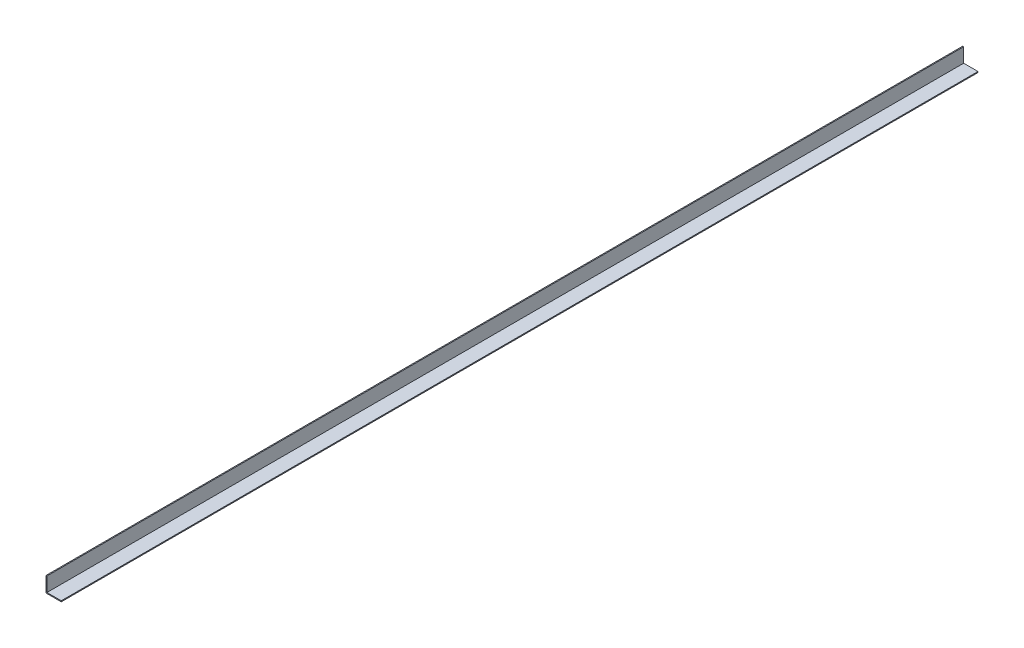
ISO-10303-21;
HEADER;
FILE_DESCRIPTION(('STEP AP214'),'2;1');
FILE_NAME('part.step','',(''),(''),'','','');
FILE_SCHEMA(('AUTOMOTIVE_DESIGN { 1 0 10303 214 1 1 1 1 }'));
ENDSEC;
DATA;
#1=APPLICATION_CONTEXT('core data for automotive mechanical design processes');
#2=APPLICATION_PROTOCOL_DEFINITION('international standard','automotive_design',2000,#1);
#3=PRODUCT_CONTEXT('',#1,'mechanical');
#4=PRODUCT('Part','Part','',(#3));
#5=PRODUCT_RELATED_PRODUCT_CATEGORY('part','',(#4));
#6=PRODUCT_DEFINITION_FORMATION('','',#4);
#7=PRODUCT_DEFINITION_CONTEXT('part definition',#1,'design');
#8=PRODUCT_DEFINITION('design','',#6,#7);
#9=PRODUCT_DEFINITION_SHAPE('','',#8);
#10=(LENGTH_UNIT() NAMED_UNIT(*) SI_UNIT(.MILLI.,.METRE.));
#11=(NAMED_UNIT(*) PLANE_ANGLE_UNIT() SI_UNIT($,.RADIAN.));
#12=(NAMED_UNIT(*) SI_UNIT($,.STERADIAN.) SOLID_ANGLE_UNIT());
#13=UNCERTAINTY_MEASURE_WITH_UNIT(LENGTH_MEASURE(1.E-05),#10,'distance_accuracy_value','');
#14=(GEOMETRIC_REPRESENTATION_CONTEXT(3) GLOBAL_UNCERTAINTY_ASSIGNED_CONTEXT((#13)) GLOBAL_UNIT_ASSIGNED_CONTEXT((#10,
#11,#12)) REPRESENTATION_CONTEXT('',''));
#15=CARTESIAN_POINT('',(0.,0.,0.));
#16=DIRECTION('',(0.,0.,1.));
#17=DIRECTION('',(1.,0.,0.));
#18=AXIS2_PLACEMENT_3D('',#15,#16,#17);
#19=CARTESIAN_POINT('',(6.35,101.6,-6100.));
#20=DIRECTION('',(0.,1.,0.));
#21=DIRECTION('',(0.,0.,1.));
#22=AXIS2_PLACEMENT_3D('',#19,#20,#21);
#23=PLANE('',#22);
#24=DIRECTION('',(-1.,0.,0.));
#25=VECTOR('',#24,1.);
#26=CARTESIAN_POINT('',(6.35,101.6,0.));
#27=LINE('',#26,#25);
#28=CARTESIAN_POINT('',(6.35,101.6,0.));
#29=VERTEX_POINT('',#28);
#30=CARTESIAN_POINT('',(0.,101.6,0.));
#31=VERTEX_POINT('',#30);
#32=EDGE_CURVE('E118',#29,#31,#27,.T.);
#33=ORIENTED_EDGE('',*,*,#32,.F.);
#34=DIRECTION('',(0.,0.,1.));
#35=VECTOR('',#34,1.);
#36=CARTESIAN_POINT('',(6.35,101.6,-6100.));
#37=LINE('',#36,#35);
#38=CARTESIAN_POINT('',(6.35,101.6,-6100.));
#39=VERTEX_POINT('',#38);
#40=EDGE_CURVE('E11',#39,#29,#37,.T.);
#41=ORIENTED_EDGE('',*,*,#40,.F.);
#42=DIRECTION('',(-1.,0.,0.));
#43=VECTOR('',#42,1.);
#44=CARTESIAN_POINT('',(6.35,101.6,-6100.));
#45=LINE('',#44,#43);
#46=CARTESIAN_POINT('',(0.,101.6,-6100.));
#47=VERTEX_POINT('',#46);
#48=EDGE_CURVE('E132',#39,#47,#45,.T.);
#49=ORIENTED_EDGE('',*,*,#48,.T.);
#50=DIRECTION('',(0.,0.,1.));
#51=VECTOR('',#50,1.);
#52=CARTESIAN_POINT('',(0.,101.6,-6100.));
#53=LINE('',#52,#51);
#54=EDGE_CURVE('E36',#47,#31,#53,.T.);
#55=ORIENTED_EDGE('',*,*,#54,.T.);
#56=EDGE_LOOP('',(#33,#41,#49,#55));
#57=FACE_BOUND('',#56,.T.);
#58=ADVANCED_FACE('F33',(#57),#23,.T.);
#59=CARTESIAN_POINT('',(6.35,6.35,-6100.));
#60=DIRECTION('',(1.,0.,0.));
#61=DIRECTION('',(0.,1.,0.));
#62=AXIS2_PLACEMENT_3D('',#59,#60,#61);
#63=PLANE('',#62);
#64=DIRECTION('',(0.,1.,0.));
#65=VECTOR('',#64,1.);
#66=CARTESIAN_POINT('',(6.35,6.35,0.));
#67=LINE('',#66,#65);
#68=CARTESIAN_POINT('',(6.35,6.35,0.));
#69=VERTEX_POINT('',#68);
#70=EDGE_CURVE('E130',#69,#29,#67,.T.);
#71=ORIENTED_EDGE('',*,*,#70,.F.);
#72=DIRECTION('',(0.,0.,1.));
#73=VECTOR('',#72,1.);
#74=CARTESIAN_POINT('',(6.35,6.35,-6100.));
#75=LINE('',#74,#73);
#76=CARTESIAN_POINT('',(6.35,6.35,-6100.));
#77=VERTEX_POINT('',#76);
#78=EDGE_CURVE('E42',#77,#69,#75,.T.);
#79=ORIENTED_EDGE('',*,*,#78,.F.);
#80=DIRECTION('',(0.,1.,0.));
#81=VECTOR('',#80,1.);
#82=CARTESIAN_POINT('',(6.35,6.35,-6100.));
#83=LINE('',#82,#81);
#84=EDGE_CURVE('E108',#77,#39,#83,.T.);
#85=ORIENTED_EDGE('',*,*,#84,.T.);
#86=ORIENTED_EDGE('',*,*,#40,.T.);
#87=EDGE_LOOP('',(#71,#79,#85,#86));
#88=FACE_BOUND('',#87,.T.);
#89=ADVANCED_FACE('F140',(#88),#63,.T.);
#90=CARTESIAN_POINT('',(101.6,6.35,-6100.));
#91=DIRECTION('',(0.,1.,0.));
#92=DIRECTION('',(-1.,0.,0.));
#93=AXIS2_PLACEMENT_3D('',#90,#91,#92);
#94=PLANE('',#93);
#95=DIRECTION('',(-1.,0.,0.));
#96=VECTOR('',#95,1.);
#97=CARTESIAN_POINT('',(101.6,6.35,0.));
#98=LINE('',#97,#96);
#99=CARTESIAN_POINT('',(101.6,6.35,0.));
#100=VERTEX_POINT('',#99);
#101=EDGE_CURVE('E95',#100,#69,#98,.T.);
#102=ORIENTED_EDGE('',*,*,#101,.F.);
#103=DIRECTION('',(0.,0.,1.));
#104=VECTOR('',#103,1.);
#105=CARTESIAN_POINT('',(101.6,6.35,-6100.));
#106=LINE('',#105,#104);
#107=CARTESIAN_POINT('',(101.6,6.35,-6100.));
#108=VERTEX_POINT('',#107);
#109=EDGE_CURVE('E90',#108,#100,#106,.T.);
#110=ORIENTED_EDGE('',*,*,#109,.F.);
#111=DIRECTION('',(-1.,0.,0.));
#112=VECTOR('',#111,1.);
#113=CARTESIAN_POINT('',(101.6,6.35,-6100.));
#114=LINE('',#113,#112);
#115=EDGE_CURVE('E93',#108,#77,#114,.T.);
#116=ORIENTED_EDGE('',*,*,#115,.T.);
#117=ORIENTED_EDGE('',*,*,#78,.T.);
#118=EDGE_LOOP('',(#102,#110,#116,#117));
#119=FACE_BOUND('',#118,.T.);
#120=ADVANCED_FACE('F92',(#119),#94,.T.);
#121=CARTESIAN_POINT('',(101.6,0.,-6100.));
#122=DIRECTION('',(1.,0.,0.));
#123=DIRECTION('',(0.,0.,-1.));
#124=AXIS2_PLACEMENT_3D('',#121,#122,#123);
#125=PLANE('',#124);
#126=DIRECTION('',(0.,1.,0.));
#127=VECTOR('',#126,1.);
#128=CARTESIAN_POINT('',(101.6,0.,0.));
#129=LINE('',#128,#127);
#130=CARTESIAN_POINT('',(101.6,0.,0.));
#131=VERTEX_POINT('',#130);
#132=EDGE_CURVE('E127',#131,#100,#129,.T.);
#133=ORIENTED_EDGE('',*,*,#132,.F.);
#134=DIRECTION('',(0.,0.,1.));
#135=VECTOR('',#134,1.);
#136=CARTESIAN_POINT('',(101.6,0.,-6100.));
#137=LINE('',#136,#135);
#138=CARTESIAN_POINT('',(101.6,0.,-6100.));
#139=VERTEX_POINT('',#138);
#140=EDGE_CURVE('E100',#139,#131,#137,.T.);
#141=ORIENTED_EDGE('',*,*,#140,.F.);
#142=DIRECTION('',(0.,1.,0.));
#143=VECTOR('',#142,1.);
#144=CARTESIAN_POINT('',(101.6,0.,-6100.));
#145=LINE('',#144,#143);
#146=EDGE_CURVE('E106',#139,#108,#145,.T.);
#147=ORIENTED_EDGE('',*,*,#146,.T.);
#148=ORIENTED_EDGE('',*,*,#109,.T.);
#149=EDGE_LOOP('',(#133,#141,#147,#148));
#150=FACE_BOUND('',#149,.T.);
#151=ADVANCED_FACE('F110',(#150),#125,.T.);
#152=CARTESIAN_POINT('',(0.,0.,-6100.));
#153=DIRECTION('',(0.,-1.,0.));
#154=DIRECTION('',(0.,0.,-1.));
#155=AXIS2_PLACEMENT_3D('',#152,#153,#154);
#156=PLANE('',#155);
#157=DIRECTION('',(1.,0.,0.));
#158=VECTOR('',#157,1.);
#159=CARTESIAN_POINT('',(0.,0.,0.));
#160=LINE('',#159,#158);
#161=CARTESIAN_POINT('',(0.,0.,0.));
#162=VERTEX_POINT('',#161);
#163=EDGE_CURVE('E124',#162,#131,#160,.T.);
#164=ORIENTED_EDGE('',*,*,#163,.F.);
#165=DIRECTION('',(0.,0.,1.));
#166=VECTOR('',#165,1.);
#167=CARTESIAN_POINT('',(0.,0.,-6100.));
#168=LINE('',#167,#166);
#169=CARTESIAN_POINT('',(0.,0.,-6100.));
#170=VERTEX_POINT('',#169);
#171=EDGE_CURVE('E135',#170,#162,#168,.T.);
#172=ORIENTED_EDGE('',*,*,#171,.F.);
#173=DIRECTION('',(1.,0.,0.));
#174=VECTOR('',#173,1.);
#175=CARTESIAN_POINT('',(0.,0.,-6100.));
#176=LINE('',#175,#174);
#177=EDGE_CURVE('E111',#170,#139,#176,.T.);
#178=ORIENTED_EDGE('',*,*,#177,.T.);
#179=ORIENTED_EDGE('',*,*,#140,.T.);
#180=EDGE_LOOP('',(#164,#172,#178,#179));
#181=FACE_BOUND('',#180,.T.);
#182=ADVANCED_FACE('F153',(#181),#156,.T.);
#183=CARTESIAN_POINT('',(0.,101.6,-6100.));
#184=DIRECTION('',(-1.,0.,0.));
#185=DIRECTION('',(0.,-1.,0.));
#186=AXIS2_PLACEMENT_3D('',#183,#184,#185);
#187=PLANE('',#186);
#188=DIRECTION('',(0.,-1.,0.));
#189=VECTOR('',#188,1.);
#190=CARTESIAN_POINT('',(0.,101.6,0.));
#191=LINE('',#190,#189);
#192=EDGE_CURVE('E121',#31,#162,#191,.T.);
#193=ORIENTED_EDGE('',*,*,#192,.F.);
#194=ORIENTED_EDGE('',*,*,#54,.F.);
#195=DIRECTION('',(0.,-1.,0.));
#196=VECTOR('',#195,1.);
#197=CARTESIAN_POINT('',(0.,101.6,-6100.));
#198=LINE('',#197,#196);
#199=EDGE_CURVE('E113',#47,#170,#198,.T.);
#200=ORIENTED_EDGE('',*,*,#199,.T.);
#201=ORIENTED_EDGE('',*,*,#171,.T.);
#202=EDGE_LOOP('',(#193,#194,#200,#201));
#203=FACE_BOUND('',#202,.T.);
#204=ADVANCED_FACE('F137',(#203),#187,.T.);
#205=CARTESIAN_POINT('',(0.,0.,-6100.));
#206=DIRECTION('',(0.,0.,1.));
#207=DIRECTION('',(1.,0.,0.));
#208=AXIS2_PLACEMENT_3D('',#205,#206,#207);
#209=PLANE('',#208);
#210=ORIENTED_EDGE('',*,*,#48,.F.);
#211=ORIENTED_EDGE('',*,*,#84,.F.);
#212=ORIENTED_EDGE('',*,*,#115,.F.);
#213=ORIENTED_EDGE('',*,*,#146,.F.);
#214=ORIENTED_EDGE('',*,*,#177,.F.);
#215=ORIENTED_EDGE('',*,*,#199,.F.);
#216=EDGE_LOOP('',(#210,#211,#212,#213,#214,#215));
#217=FACE_BOUND('',#216,.T.);
#218=ADVANCED_FACE('F104',(#217),#209,.F.);
#219=CARTESIAN_POINT('',(0.,0.,0.));
#220=DIRECTION('',(0.,0.,1.));
#221=DIRECTION('',(1.,0.,0.));
#222=AXIS2_PLACEMENT_3D('',#219,#220,#221);
#223=PLANE('',#222);
#224=ORIENTED_EDGE('',*,*,#32,.T.);
#225=ORIENTED_EDGE('',*,*,#192,.T.);
#226=ORIENTED_EDGE('',*,*,#163,.T.);
#227=ORIENTED_EDGE('',*,*,#132,.T.);
#228=ORIENTED_EDGE('',*,*,#101,.T.);
#229=ORIENTED_EDGE('',*,*,#70,.T.);
#230=EDGE_LOOP('',(#224,#225,#226,#227,#228,#229));
#231=FACE_BOUND('',#230,.T.);
#232=ADVANCED_FACE('F139',(#231),#223,.T.);
#233=CLOSED_SHELL('',(#58,#89,#120,#151,#182,#204,#218,#232));
#234=MANIFOLD_SOLID_BREP('B2',#233);
#235=ADVANCED_BREP_SHAPE_REPRESENTATION('',(#18,#234),#14);
#236=SHAPE_DEFINITION_REPRESENTATION(#9,#235);
ENDSEC;
END-ISO-10303-21;
